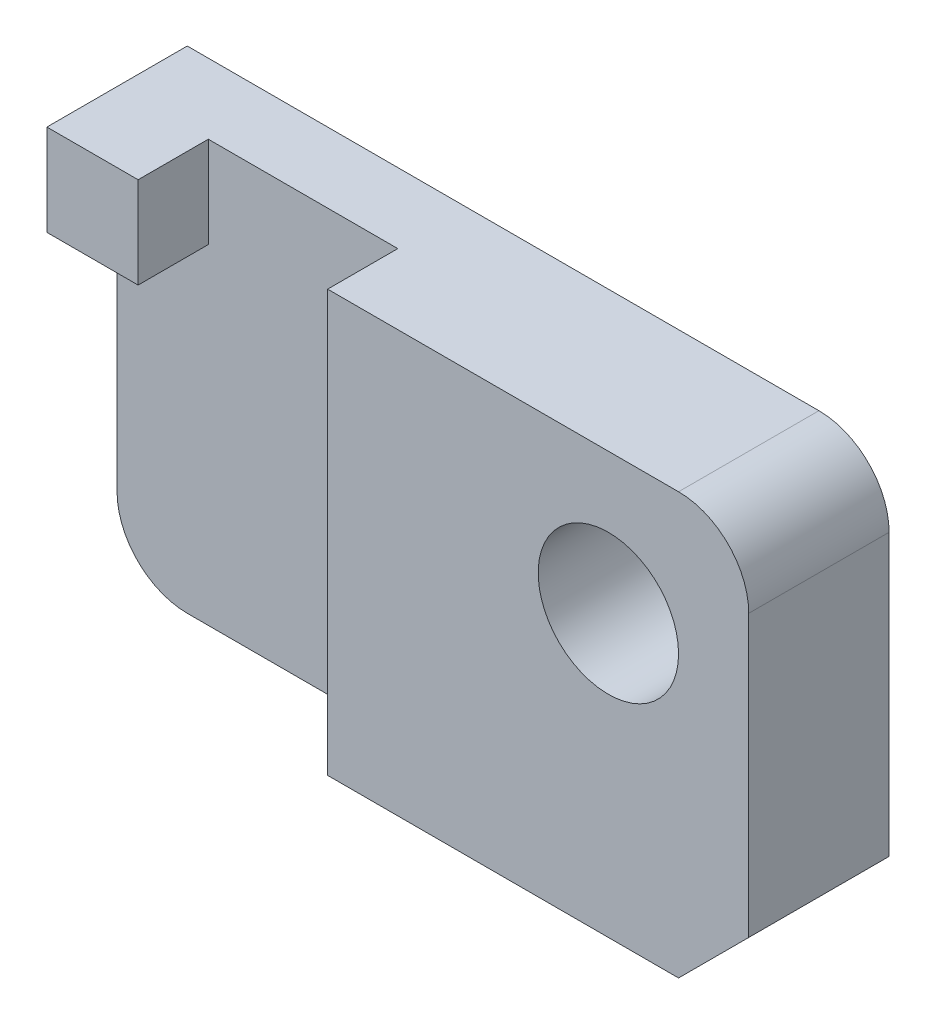
ISO-10303-21;
HEADER;
FILE_DESCRIPTION(('STEP AP214'),'2;1');
FILE_NAME('part.step','',(''),(''),'','','');
FILE_SCHEMA(('AUTOMOTIVE_DESIGN { 1 0 10303 214 1 1 1 1 }'));
ENDSEC;
DATA;
#1=APPLICATION_CONTEXT('core data for automotive mechanical design processes');
#2=APPLICATION_PROTOCOL_DEFINITION('international standard','automotive_design',2000,#1);
#3=PRODUCT_CONTEXT('',#1,'mechanical');
#4=PRODUCT('Part','Part','',(#3));
#5=PRODUCT_RELATED_PRODUCT_CATEGORY('part','',(#4));
#6=PRODUCT_DEFINITION_FORMATION('','',#4);
#7=PRODUCT_DEFINITION_CONTEXT('part definition',#1,'design');
#8=PRODUCT_DEFINITION('design','',#6,#7);
#9=PRODUCT_DEFINITION_SHAPE('','',#8);
#10=(LENGTH_UNIT() NAMED_UNIT(*) SI_UNIT(.MILLI.,.METRE.));
#11=(NAMED_UNIT(*) PLANE_ANGLE_UNIT() SI_UNIT($,.RADIAN.));
#12=(NAMED_UNIT(*) SI_UNIT($,.STERADIAN.) SOLID_ANGLE_UNIT());
#13=UNCERTAINTY_MEASURE_WITH_UNIT(LENGTH_MEASURE(1.E-05),#10,'distance_accuracy_value','');
#14=(GEOMETRIC_REPRESENTATION_CONTEXT(3) GLOBAL_UNCERTAINTY_ASSIGNED_CONTEXT((#13)) GLOBAL_UNIT_ASSIGNED_CONTEXT((#10,
#11,#12)) REPRESENTATION_CONTEXT('',''));
#15=CARTESIAN_POINT('',(0.,0.,0.));
#16=DIRECTION('',(0.,0.,1.));
#17=DIRECTION('',(1.,0.,0.));
#18=AXIS2_PLACEMENT_3D('',#15,#16,#17);
#19=CARTESIAN_POINT('',(163.543809627722,0.,25.4));
#20=DIRECTION('',(1.,0.,0.));
#21=DIRECTION('',(0.,0.,-1.));
#22=AXIS2_PLACEMENT_3D('',#19,#20,#21);
#23=PLANE('',#22);
#24=DIRECTION('',(0.,-1.,0.));
#25=VECTOR('',#24,1.);
#26=CARTESIAN_POINT('',(163.543809627722,0.,0.));
#27=LINE('',#26,#25);
#28=CARTESIAN_POINT('',(163.543809627722,33.5033122032001,0.));
#29=VERTEX_POINT('',#28);
#30=CARTESIAN_POINT('',(163.543809627722,-17.2966877967999,0.));
#31=VERTEX_POINT('',#30);
#32=EDGE_CURVE('E142',#29,#31,#27,.T.);
#33=ORIENTED_EDGE('',*,*,#32,.F.);
#34=DIRECTION('',(0.,0.,-1.));
#35=VECTOR('',#34,1.);
#36=CARTESIAN_POINT('',(163.543809627722,33.5033122032001,25.4));
#37=LINE('',#36,#35);
#38=CARTESIAN_POINT('',(163.543809627722,33.5033122032001,25.4));
#39=VERTEX_POINT('',#38);
#40=EDGE_CURVE('E11',#39,#29,#37,.T.);
#41=ORIENTED_EDGE('',*,*,#40,.F.);
#42=DIRECTION('',(0.,-1.,0.));
#43=VECTOR('',#42,1.);
#44=CARTESIAN_POINT('',(163.543809627722,0.,25.4));
#45=LINE('',#44,#43);
#46=CARTESIAN_POINT('',(163.543809627722,-17.2966877967999,25.4));
#47=VERTEX_POINT('',#46);
#48=EDGE_CURVE('E270',#39,#47,#45,.T.);
#49=ORIENTED_EDGE('',*,*,#48,.T.);
#50=DIRECTION('',(0.,0.,-1.));
#51=VECTOR('',#50,1.);
#52=CARTESIAN_POINT('',(163.543809627722,-17.2966877967999,25.4));
#53=LINE('',#52,#51);
#54=EDGE_CURVE('E83',#47,#31,#53,.T.);
#55=ORIENTED_EDGE('',*,*,#54,.T.);
#56=EDGE_LOOP('',(#33,#41,#49,#55));
#57=FACE_BOUND('',#56,.T.);
#58=ADVANCED_FACE('F39',(#57),#23,.T.);
#59=CARTESIAN_POINT('',(150.843809627722,33.5033122032001,25.4));
#60=DIRECTION('',(0.,0.,-1.));
#61=DIRECTION('',(-1.,0.,0.));
#62=AXIS2_PLACEMENT_3D('',#59,#60,#61);
#63=CYLINDRICAL_SURFACE('',#62,12.7);
#64=CARTESIAN_POINT('',(150.843809627722,33.5033122032001,0.));
#65=DIRECTION('',(0.,0.,1.));
#66=DIRECTION('',(1.,0.,0.));
#67=AXIS2_PLACEMENT_3D('',#64,#65,#66);
#68=CIRCLE('',#67,12.7);
#69=CARTESIAN_POINT('',(150.843809627722,46.2033122032001,0.));
#70=VERTEX_POINT('',#69);
#71=EDGE_CURVE('E138',#29,#70,#68,.T.);
#72=ORIENTED_EDGE('',*,*,#71,.T.);
#73=DIRECTION('',(0.,0.,-1.));
#74=VECTOR('',#73,1.);
#75=CARTESIAN_POINT('',(150.843809627722,46.2033122032001,25.4));
#76=LINE('',#75,#74);
#77=CARTESIAN_POINT('',(150.843809627722,46.2033122032001,25.4));
#78=VERTEX_POINT('',#77);
#79=EDGE_CURVE('E47',#78,#70,#76,.T.);
#80=ORIENTED_EDGE('',*,*,#79,.F.);
#81=CARTESIAN_POINT('',(150.843809627722,33.5033122032001,25.4));
#82=DIRECTION('',(0.,0.,1.));
#83=DIRECTION('',(1.,0.,0.));
#84=AXIS2_PLACEMENT_3D('',#81,#82,#83);
#85=CIRCLE('',#84,12.7);
#86=EDGE_CURVE('E272',#39,#78,#85,.T.);
#87=ORIENTED_EDGE('',*,*,#86,.F.);
#88=ORIENTED_EDGE('',*,*,#40,.T.);
#89=EDGE_LOOP('',(#72,#80,#87,#88));
#90=FACE_BOUND('',#89,.T.);
#91=ADVANCED_FACE('F139',(#90),#63,.T.);
#92=CARTESIAN_POINT('',(0.,46.2033122032001,25.4));
#93=DIRECTION('',(0.,1.,0.));
#94=DIRECTION('',(-1.,0.,0.));
#95=AXIS2_PLACEMENT_3D('',#92,#93,#94);
#96=PLANE('',#95);
#97=DIRECTION('',(1.,0.,0.));
#98=VECTOR('',#97,1.);
#99=CARTESIAN_POINT('',(0.,46.2033122032001,0.));
#100=LINE('',#99,#98);
#101=CARTESIAN_POINT('',(36.5438096277222,46.2033122032001,0.));
#102=VERTEX_POINT('',#101);
#103=EDGE_CURVE('E134',#102,#70,#100,.T.);
#104=ORIENTED_EDGE('',*,*,#103,.F.);
#105=DIRECTION('',(0.,0.,-1.));
#106=VECTOR('',#105,1.);
#107=CARTESIAN_POINT('',(36.5438096277222,46.2033122032001,25.4));
#108=LINE('',#107,#106);
#109=CARTESIAN_POINT('',(36.5438096277222,46.2033122032001,25.4));
#110=VERTEX_POINT('',#109);
#111=EDGE_CURVE('E230',#110,#102,#108,.T.);
#112=ORIENTED_EDGE('',*,*,#111,.F.);
#113=DIRECTION('',(1.,0.,0.));
#114=VECTOR('',#113,1.);
#115=CARTESIAN_POINT('',(0.,46.2033122032001,25.4));
#116=LINE('',#115,#114);
#117=CARTESIAN_POINT('',(53.0538096277222,46.2033122032001,25.4));
#118=VERTEX_POINT('',#117);
#119=EDGE_CURVE('E217',#110,#118,#116,.T.);
#120=ORIENTED_EDGE('',*,*,#119,.T.);
#121=DIRECTION('',(0.,0.,-1.));
#122=VECTOR('',#121,1.);
#123=CARTESIAN_POINT('',(53.0538096277222,46.2033122032001,25.4));
#124=LINE('',#123,#122);
#125=CARTESIAN_POINT('',(53.0538096277222,46.2033122032001,12.7));
#126=VERTEX_POINT('',#125);
#127=EDGE_CURVE('E229',#118,#126,#124,.T.);
#128=ORIENTED_EDGE('',*,*,#127,.T.);
#129=DIRECTION('',(1.,0.,0.));
#130=VECTOR('',#129,1.);
#131=CARTESIAN_POINT('',(0.,46.2033122032001,12.7));
#132=LINE('',#131,#130);
#133=CARTESIAN_POINT('',(87.3438096277222,46.2033122032001,12.7));
#134=VERTEX_POINT('',#133);
#135=EDGE_CURVE('E250',#126,#134,#132,.T.);
#136=ORIENTED_EDGE('',*,*,#135,.T.);
#137=DIRECTION('',(0.,0.,-1.));
#138=VECTOR('',#137,1.);
#139=CARTESIAN_POINT('',(87.3438096277222,46.2033122032001,25.4));
#140=LINE('',#139,#138);
#141=CARTESIAN_POINT('',(87.3438096277222,46.2033122032001,25.4));
#142=VERTEX_POINT('',#141);
#143=EDGE_CURVE('E121',#142,#134,#140,.T.);
#144=ORIENTED_EDGE('',*,*,#143,.F.);
#145=DIRECTION('',(1.,0.,0.));
#146=VECTOR('',#145,1.);
#147=CARTESIAN_POINT('',(0.,46.2033122032001,25.4));
#148=LINE('',#147,#146);
#149=EDGE_CURVE('E115',#142,#78,#148,.T.);
#150=ORIENTED_EDGE('',*,*,#149,.T.);
#151=ORIENTED_EDGE('',*,*,#79,.T.);
#152=EDGE_LOOP('',(#104,#112,#120,#128,#136,#144,#150,#151));
#153=FACE_BOUND('',#152,.T.);
#154=ADVANCED_FACE('F130',(#153),#96,.T.);
#155=CARTESIAN_POINT('',(87.3438096277222,0.,25.4));
#156=DIRECTION('',(1.,0.,0.));
#157=DIRECTION('',(0.,1.,0.));
#158=AXIS2_PLACEMENT_3D('',#155,#156,#157);
#159=PLANE('',#158);
#160=ORIENTED_EDGE('',*,*,#143,.T.);
#161=DIRECTION('',(0.,-1.,0.));
#162=VECTOR('',#161,1.);
#163=CARTESIAN_POINT('',(87.3438096277222,0.,12.7));
#164=LINE('',#163,#162);
#165=CARTESIAN_POINT('',(87.3438096277222,-29.9966877967999,12.7));
#166=VERTEX_POINT('',#165);
#167=EDGE_CURVE('E120',#134,#166,#164,.T.);
#168=ORIENTED_EDGE('',*,*,#167,.T.);
#169=DIRECTION('',(0.,0.,-1.));
#170=VECTOR('',#169,1.);
#171=CARTESIAN_POINT('',(87.3438096277222,-29.9966877967999,25.4));
#172=LINE('',#171,#170);
#173=CARTESIAN_POINT('',(87.3438096277222,-29.9966877967999,25.4));
#174=VERTEX_POINT('',#173);
#175=EDGE_CURVE('E106',#174,#166,#172,.T.);
#176=ORIENTED_EDGE('',*,*,#175,.F.);
#177=DIRECTION('',(0.,-1.,0.));
#178=VECTOR('',#177,1.);
#179=CARTESIAN_POINT('',(87.3438096277222,0.,25.4));
#180=LINE('',#179,#178);
#181=EDGE_CURVE('E109',#142,#174,#180,.T.);
#182=ORIENTED_EDGE('',*,*,#181,.F.);
#183=EDGE_LOOP('',(#160,#168,#176,#182));
#184=FACE_BOUND('',#183,.T.);
#185=ADVANCED_FACE('F119',(#184),#159,.F.);
#186=CARTESIAN_POINT('',(0.,-29.9966877967999,25.4));
#187=DIRECTION('',(0.,1.,0.));
#188=DIRECTION('',(0.,0.,1.));
#189=AXIS2_PLACEMENT_3D('',#186,#187,#188);
#190=PLANE('',#189);
#191=DIRECTION('',(1.,0.,0.));
#192=VECTOR('',#191,1.);
#193=CARTESIAN_POINT('',(0.,-29.9966877967999,0.));
#194=LINE('',#193,#192);
#195=CARTESIAN_POINT('',(49.2438096277223,-29.9966877967999,0.));
#196=VERTEX_POINT('',#195);
#197=CARTESIAN_POINT('',(150.843809627722,-29.9966877967999,0.));
#198=VERTEX_POINT('',#197);
#199=EDGE_CURVE('E149',#196,#198,#194,.T.);
#200=ORIENTED_EDGE('',*,*,#199,.T.);
#201=DIRECTION('',(0.,0.,-1.));
#202=VECTOR('',#201,1.);
#203=CARTESIAN_POINT('',(150.843809627722,-29.9966877967999,25.4));
#204=LINE('',#203,#202);
#205=CARTESIAN_POINT('',(150.843809627722,-29.9966877967999,25.4));
#206=VERTEX_POINT('',#205);
#207=EDGE_CURVE('E108',#206,#198,#204,.T.);
#208=ORIENTED_EDGE('',*,*,#207,.F.);
#209=DIRECTION('',(1.,0.,0.));
#210=VECTOR('',#209,1.);
#211=CARTESIAN_POINT('',(0.,-29.9966877967999,25.4));
#212=LINE('',#211,#210);
#213=EDGE_CURVE('E101',#174,#206,#212,.T.);
#214=ORIENTED_EDGE('',*,*,#213,.F.);
#215=ORIENTED_EDGE('',*,*,#175,.T.);
#216=DIRECTION('',(1.,0.,0.));
#217=VECTOR('',#216,1.);
#218=CARTESIAN_POINT('',(0.,-29.9966877967999,12.7));
#219=LINE('',#218,#217);
#220=CARTESIAN_POINT('',(49.2438096277223,-29.9966877967999,12.7));
#221=VERTEX_POINT('',#220);
#222=EDGE_CURVE('E54',#221,#166,#219,.T.);
#223=ORIENTED_EDGE('',*,*,#222,.F.);
#224=DIRECTION('',(0.,0.,-1.));
#225=VECTOR('',#224,1.);
#226=CARTESIAN_POINT('',(49.2438096277223,-29.9966877967999,12.7));
#227=LINE('',#226,#225);
#228=EDGE_CURVE('E160',#221,#196,#227,.T.);
#229=ORIENTED_EDGE('',*,*,#228,.T.);
#230=EDGE_LOOP('',(#200,#208,#214,#215,#223,#229));
#231=FACE_BOUND('',#230,.T.);
#232=ADVANCED_FACE('F104',(#231),#190,.F.);
#233=CARTESIAN_POINT('',(138.143809627722,20.8033122032001,25.4));
#234=DIRECTION('',(0.,0.,-1.));
#235=DIRECTION('',(-1.,0.,0.));
#236=AXIS2_PLACEMENT_3D('',#233,#234,#235);
#237=CYLINDRICAL_SURFACE('',#236,12.7);
#238=CARTESIAN_POINT('',(138.143809627722,20.8033122032001,25.4));
#239=DIRECTION('',(0.,0.,1.));
#240=DIRECTION('',(1.,0.,0.));
#241=AXIS2_PLACEMENT_3D('',#238,#239,#240);
#242=CIRCLE('',#241,12.7);
#243=CARTESIAN_POINT('',(150.843809627722,20.8033122032001,25.4));
#244=VERTEX_POINT('',#243);
#245=EDGE_CURVE('E155',#244,#244,#242,.T.);
#246=ORIENTED_EDGE('',*,*,#245,.T.);
#247=EDGE_LOOP('',(#246));
#248=FACE_BOUND('',#247,.T.);
#249=CARTESIAN_POINT('',(138.143809627722,20.8033122032001,0.));
#250=DIRECTION('',(0.,0.,1.));
#251=DIRECTION('',(1.,0.,0.));
#252=AXIS2_PLACEMENT_3D('',#249,#250,#251);
#253=CIRCLE('',#252,12.7);
#254=CARTESIAN_POINT('',(150.843809627722,20.8033122032001,0.));
#255=VERTEX_POINT('',#254);
#256=EDGE_CURVE('E158',#255,#255,#253,.T.);
#257=ORIENTED_EDGE('',*,*,#256,.F.);
#258=EDGE_LOOP('',(#257));
#259=FACE_BOUND('',#258,.T.);
#260=ADVANCED_FACE('F41',(#248,#259),#237,.F.);
#261=CARTESIAN_POINT('',(90.4202487122613,-90.420248712261,25.4));
#262=DIRECTION('',(-0.707106781186548,0.707106781186546,0.));
#263=DIRECTION('',(-0.707106781186547,-0.707106781186549,0.));
#264=AXIS2_PLACEMENT_3D('',#261,#262,#263);
#265=PLANE('',#264);
#266=DIRECTION('',(0.707106781186546,0.707106781186549,0.));
#267=VECTOR('',#266,1.);
#268=CARTESIAN_POINT('',(90.4202487122613,-90.420248712261,0.));
#269=LINE('',#268,#267);
#270=EDGE_CURVE('E151',#198,#31,#269,.T.);
#271=ORIENTED_EDGE('',*,*,#270,.T.);
#272=ORIENTED_EDGE('',*,*,#54,.F.);
#273=DIRECTION('',(0.707106781186546,0.707106781186549,0.));
#274=VECTOR('',#273,1.);
#275=CARTESIAN_POINT('',(90.4202487122613,-90.420248712261,25.4));
#276=LINE('',#275,#274);
#277=EDGE_CURVE('E63',#206,#47,#276,.T.);
#278=ORIENTED_EDGE('',*,*,#277,.F.);
#279=ORIENTED_EDGE('',*,*,#207,.T.);
#280=EDGE_LOOP('',(#271,#272,#278,#279));
#281=FACE_BOUND('',#280,.T.);
#282=ADVANCED_FACE('F174',(#281),#265,.F.);
#283=CARTESIAN_POINT('',(0.,0.,25.4));
#284=DIRECTION('',(0.,0.,1.));
#285=DIRECTION('',(1.,0.,0.));
#286=AXIS2_PLACEMENT_3D('',#283,#284,#285);
#287=PLANE('',#286);
#288=ORIENTED_EDGE('',*,*,#245,.F.);
#289=EDGE_LOOP('',(#288));
#290=FACE_BOUND('',#289,.T.);
#291=ORIENTED_EDGE('',*,*,#48,.F.);
#292=ORIENTED_EDGE('',*,*,#86,.T.);
#293=ORIENTED_EDGE('',*,*,#149,.F.);
#294=ORIENTED_EDGE('',*,*,#181,.T.);
#295=ORIENTED_EDGE('',*,*,#213,.T.);
#296=ORIENTED_EDGE('',*,*,#277,.T.);
#297=EDGE_LOOP('',(#291,#292,#293,#294,#295,#296));
#298=FACE_BOUND('',#297,.T.);
#299=ADVANCED_FACE('F113',(#290,#298),#287,.T.);
#300=CARTESIAN_POINT('',(0.,0.,0.));
#301=DIRECTION('',(0.,0.,1.));
#302=DIRECTION('',(1.,0.,0.));
#303=AXIS2_PLACEMENT_3D('',#300,#301,#302);
#304=PLANE('',#303);
#305=ORIENTED_EDGE('',*,*,#256,.T.);
#306=EDGE_LOOP('',(#305));
#307=FACE_BOUND('',#306,.T.);
#308=ORIENTED_EDGE('',*,*,#32,.T.);
#309=ORIENTED_EDGE('',*,*,#270,.F.);
#310=ORIENTED_EDGE('',*,*,#199,.F.);
#311=CARTESIAN_POINT('',(49.2438096277223,-17.2966877967999,0.));
#312=DIRECTION('',(0.,0.,1.));
#313=DIRECTION('',(1.,0.,0.));
#314=AXIS2_PLACEMENT_3D('',#311,#312,#313);
#315=CIRCLE('',#314,12.7);
#316=CARTESIAN_POINT('',(36.5438096277223,-17.2966877967999,0.));
#317=VERTEX_POINT('',#316);
#318=EDGE_CURVE('E244',#196,#317,#315,.F.);
#319=ORIENTED_EDGE('',*,*,#318,.T.);
#320=DIRECTION('',(0.,-1.,0.));
#321=VECTOR('',#320,1.);
#322=CARTESIAN_POINT('',(36.5438096277223,0.,0.));
#323=LINE('',#322,#321);
#324=EDGE_CURVE('E147',#102,#317,#323,.T.);
#325=ORIENTED_EDGE('',*,*,#324,.F.);
#326=ORIENTED_EDGE('',*,*,#103,.T.);
#327=ORIENTED_EDGE('',*,*,#71,.F.);
#328=EDGE_LOOP('',(#308,#309,#310,#319,#325,#326,#327));
#329=FACE_BOUND('',#328,.T.);
#330=ADVANCED_FACE('F144',(#307,#329),#304,.F.);
#331=CARTESIAN_POINT('',(49.2438096277223,-17.2966877967999,12.7));
#332=DIRECTION('',(0.,0.,-1.));
#333=DIRECTION('',(-1.,0.,0.));
#334=AXIS2_PLACEMENT_3D('',#331,#332,#333);
#335=CYLINDRICAL_SURFACE('',#334,12.7);
#336=ORIENTED_EDGE('',*,*,#318,.F.);
#337=ORIENTED_EDGE('',*,*,#228,.F.);
#338=CARTESIAN_POINT('',(49.2438096277223,-17.2966877967999,12.7));
#339=DIRECTION('',(0.,0.,1.));
#340=DIRECTION('',(1.,0.,0.));
#341=AXIS2_PLACEMENT_3D('',#338,#339,#340);
#342=CIRCLE('',#341,12.7);
#343=CARTESIAN_POINT('',(36.5438096277223,-17.2966877967999,12.7));
#344=VERTEX_POINT('',#343);
#345=EDGE_CURVE('E245',#221,#344,#342,.F.);
#346=ORIENTED_EDGE('',*,*,#345,.T.);
#347=DIRECTION('',(0.,0.,-1.));
#348=VECTOR('',#347,1.);
#349=CARTESIAN_POINT('',(36.5438096277223,-17.2966877967999,12.7));
#350=LINE('',#349,#348);
#351=EDGE_CURVE('E261',#344,#317,#350,.T.);
#352=ORIENTED_EDGE('',*,*,#351,.T.);
#353=EDGE_LOOP('',(#336,#337,#346,#352));
#354=FACE_BOUND('',#353,.T.);
#355=ADVANCED_FACE('F180',(#354),#335,.T.);
#356=CARTESIAN_POINT('',(36.5438096277223,0.,12.7));
#357=DIRECTION('',(1.,0.,0.));
#358=DIRECTION('',(0.,1.,0.));
#359=AXIS2_PLACEMENT_3D('',#356,#357,#358);
#360=PLANE('',#359);
#361=ORIENTED_EDGE('',*,*,#324,.T.);
#362=ORIENTED_EDGE('',*,*,#351,.F.);
#363=DIRECTION('',(0.,-1.,0.));
#364=VECTOR('',#363,1.);
#365=CARTESIAN_POINT('',(36.5438096277223,0.,12.7));
#366=LINE('',#365,#364);
#367=CARTESIAN_POINT('',(36.5438096277223,29.6933122032001,12.7));
#368=VERTEX_POINT('',#367);
#369=EDGE_CURVE('E258',#368,#344,#366,.T.);
#370=ORIENTED_EDGE('',*,*,#369,.F.);
#371=DIRECTION('',(0.,0.,-1.));
#372=VECTOR('',#371,1.);
#373=CARTESIAN_POINT('',(36.5438096277223,29.6933122032001,25.4));
#374=LINE('',#373,#372);
#375=CARTESIAN_POINT('',(36.5438096277223,29.6933122032001,25.4));
#376=VERTEX_POINT('',#375);
#377=EDGE_CURVE('E239',#376,#368,#374,.T.);
#378=ORIENTED_EDGE('',*,*,#377,.F.);
#379=DIRECTION('',(0.,-1.,0.));
#380=VECTOR('',#379,1.);
#381=CARTESIAN_POINT('',(36.5438096277223,0.,25.4));
#382=LINE('',#381,#380);
#383=EDGE_CURVE('E232',#110,#376,#382,.T.);
#384=ORIENTED_EDGE('',*,*,#383,.F.);
#385=ORIENTED_EDGE('',*,*,#111,.T.);
#386=EDGE_LOOP('',(#361,#362,#370,#378,#384,#385));
#387=FACE_BOUND('',#386,.T.);
#388=ADVANCED_FACE('F187',(#387),#360,.F.);
#389=CARTESIAN_POINT('',(0.,0.,12.7));
#390=DIRECTION('',(0.,0.,1.));
#391=DIRECTION('',(1.,0.,0.));
#392=AXIS2_PLACEMENT_3D('',#389,#390,#391);
#393=PLANE('',#392);
#394=ORIENTED_EDGE('',*,*,#345,.F.);
#395=ORIENTED_EDGE('',*,*,#222,.T.);
#396=ORIENTED_EDGE('',*,*,#167,.F.);
#397=ORIENTED_EDGE('',*,*,#135,.F.);
#398=DIRECTION('',(0.,-1.,0.));
#399=VECTOR('',#398,1.);
#400=CARTESIAN_POINT('',(53.0538096277222,0.,12.7));
#401=LINE('',#400,#399);
#402=CARTESIAN_POINT('',(53.0538096277222,29.6933122032001,12.7));
#403=VERTEX_POINT('',#402);
#404=EDGE_CURVE('E252',#126,#403,#401,.T.);
#405=ORIENTED_EDGE('',*,*,#404,.T.);
#406=DIRECTION('',(1.,0.,0.));
#407=VECTOR('',#406,1.);
#408=CARTESIAN_POINT('',(0.,29.6933122032001,12.7));
#409=LINE('',#408,#407);
#410=EDGE_CURVE('E255',#368,#403,#409,.T.);
#411=ORIENTED_EDGE('',*,*,#410,.F.);
#412=ORIENTED_EDGE('',*,*,#369,.T.);
#413=EDGE_LOOP('',(#394,#395,#396,#397,#405,#411,#412));
#414=FACE_BOUND('',#413,.T.);
#415=ADVANCED_FACE('F191',(#414),#393,.T.);
#416=CARTESIAN_POINT('',(53.0538096277222,0.,25.4));
#417=DIRECTION('',(1.,0.,0.));
#418=DIRECTION('',(0.,0.,-1.));
#419=AXIS2_PLACEMENT_3D('',#416,#417,#418);
#420=PLANE('',#419);
#421=DIRECTION('',(0.,0.,-1.));
#422=VECTOR('',#421,1.);
#423=CARTESIAN_POINT('',(53.0538096277222,29.6933122032001,25.4));
#424=LINE('',#423,#422);
#425=CARTESIAN_POINT('',(53.0538096277222,29.6933122032001,25.4));
#426=VERTEX_POINT('',#425);
#427=EDGE_CURVE('E237',#426,#403,#424,.T.);
#428=ORIENTED_EDGE('',*,*,#427,.T.);
#429=ORIENTED_EDGE('',*,*,#404,.F.);
#430=ORIENTED_EDGE('',*,*,#127,.F.);
#431=DIRECTION('',(0.,-1.,0.));
#432=VECTOR('',#431,1.);
#433=CARTESIAN_POINT('',(53.0538096277222,0.,25.4));
#434=LINE('',#433,#432);
#435=EDGE_CURVE('E213',#118,#426,#434,.T.);
#436=ORIENTED_EDGE('',*,*,#435,.T.);
#437=EDGE_LOOP('',(#428,#429,#430,#436));
#438=FACE_BOUND('',#437,.T.);
#439=ADVANCED_FACE('F195',(#438),#420,.T.);
#440=CARTESIAN_POINT('',(0.,29.6933122032001,25.4));
#441=DIRECTION('',(0.,1.,0.));
#442=DIRECTION('',(0.,0.,1.));
#443=AXIS2_PLACEMENT_3D('',#440,#441,#442);
#444=PLANE('',#443);
#445=ORIENTED_EDGE('',*,*,#410,.T.);
#446=ORIENTED_EDGE('',*,*,#427,.F.);
#447=DIRECTION('',(1.,0.,0.));
#448=VECTOR('',#447,1.);
#449=CARTESIAN_POINT('',(0.,29.6933122032001,25.4));
#450=LINE('',#449,#448);
#451=EDGE_CURVE('E220',#376,#426,#450,.T.);
#452=ORIENTED_EDGE('',*,*,#451,.F.);
#453=ORIENTED_EDGE('',*,*,#377,.T.);
#454=EDGE_LOOP('',(#445,#446,#452,#453));
#455=FACE_BOUND('',#454,.T.);
#456=ADVANCED_FACE('F198',(#455),#444,.F.);
#457=CARTESIAN_POINT('',(0.,0.,25.4));
#458=DIRECTION('',(0.,0.,1.));
#459=DIRECTION('',(1.,0.,0.));
#460=AXIS2_PLACEMENT_3D('',#457,#458,#459);
#461=PLANE('',#460);
#462=ORIENTED_EDGE('',*,*,#435,.F.);
#463=ORIENTED_EDGE('',*,*,#119,.F.);
#464=ORIENTED_EDGE('',*,*,#383,.T.);
#465=ORIENTED_EDGE('',*,*,#451,.T.);
#466=EDGE_LOOP('',(#462,#463,#464,#465));
#467=FACE_BOUND('',#466,.T.);
#468=ADVANCED_FACE('F202',(#467),#461,.T.);
#469=CLOSED_SHELL('',(#58,#91,#154,#185,#232,#260,#282,#299,#330,#355,#388,#415,#439,#456,#468));
#470=MANIFOLD_SOLID_BREP('B2',#469);
#471=ADVANCED_BREP_SHAPE_REPRESENTATION('',(#18,#470),#14);
#472=SHAPE_DEFINITION_REPRESENTATION(#9,#471);
ENDSEC;
END-ISO-10303-21;
